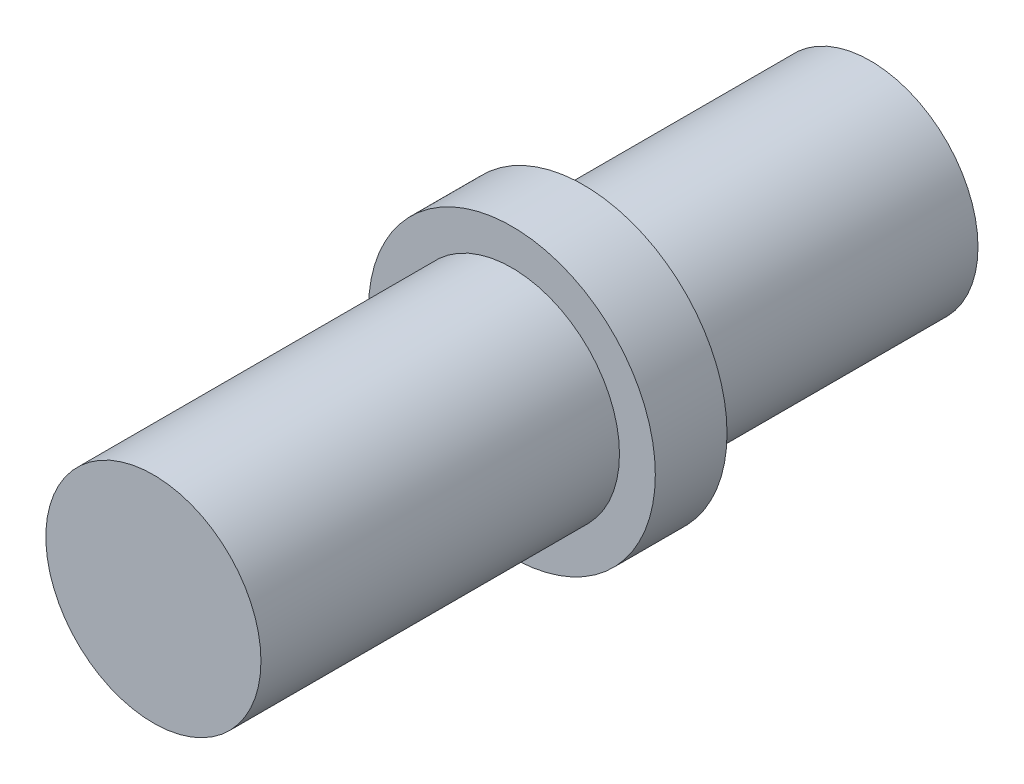
ISO-10303-21;
HEADER;
FILE_DESCRIPTION(('STEP AP214'),'2;1');
FILE_NAME('part.step','',(''),(''),'','','');
FILE_SCHEMA(('AUTOMOTIVE_DESIGN { 1 0 10303 214 1 1 1 1 }'));
ENDSEC;
DATA;
#1=APPLICATION_CONTEXT('core data for automotive mechanical design processes');
#2=APPLICATION_PROTOCOL_DEFINITION('international standard','automotive_design',2000,#1);
#3=PRODUCT_CONTEXT('',#1,'mechanical');
#4=PRODUCT('Part','Part','',(#3));
#5=PRODUCT_RELATED_PRODUCT_CATEGORY('part','',(#4));
#6=PRODUCT_DEFINITION_FORMATION('','',#4);
#7=PRODUCT_DEFINITION_CONTEXT('part definition',#1,'design');
#8=PRODUCT_DEFINITION('design','',#6,#7);
#9=PRODUCT_DEFINITION_SHAPE('','',#8);
#10=(LENGTH_UNIT() NAMED_UNIT(*) SI_UNIT(.MILLI.,.METRE.));
#11=(NAMED_UNIT(*) PLANE_ANGLE_UNIT() SI_UNIT($,.RADIAN.));
#12=(NAMED_UNIT(*) SI_UNIT($,.STERADIAN.) SOLID_ANGLE_UNIT());
#13=UNCERTAINTY_MEASURE_WITH_UNIT(LENGTH_MEASURE(1.E-05),#10,'distance_accuracy_value','');
#14=(GEOMETRIC_REPRESENTATION_CONTEXT(3) GLOBAL_UNCERTAINTY_ASSIGNED_CONTEXT((#13)) GLOBAL_UNIT_ASSIGNED_CONTEXT((#10,
#11,#12)) REPRESENTATION_CONTEXT('',''));
#15=CARTESIAN_POINT('',(0.,0.,0.));
#16=DIRECTION('',(0.,0.,1.));
#17=DIRECTION('',(1.,0.,0.));
#18=AXIS2_PLACEMENT_3D('',#15,#16,#17);
#19=CARTESIAN_POINT('',(0.,0.,20.));
#20=DIRECTION('',(0.,0.,-1.));
#21=DIRECTION('',(-1.,0.,0.));
#22=AXIS2_PLACEMENT_3D('',#19,#20,#21);
#23=CYLINDRICAL_SURFACE('',#22,3.);
#24=CARTESIAN_POINT('',(0.,0.,10.));
#25=DIRECTION('',(0.,0.,1.));
#26=DIRECTION('',(1.,0.,0.));
#27=AXIS2_PLACEMENT_3D('',#24,#25,#26);
#28=CIRCLE('',#27,3.);
#29=CARTESIAN_POINT('',(3.,0.,10.));
#30=VERTEX_POINT('',#29);
#31=EDGE_CURVE('E40',#30,#30,#28,.T.);
#32=ORIENTED_EDGE('',*,*,#31,.T.);
#33=EDGE_LOOP('',(#32));
#34=FACE_BOUND('',#33,.T.);
#35=CARTESIAN_POINT('',(0.,0.,20.));
#36=DIRECTION('',(0.,0.,1.));
#37=DIRECTION('',(1.,0.,0.));
#38=AXIS2_PLACEMENT_3D('',#35,#36,#37);
#39=CIRCLE('',#38,3.);
#40=CARTESIAN_POINT('',(3.,0.,20.));
#41=VERTEX_POINT('',#40);
#42=EDGE_CURVE('E44',#41,#41,#39,.T.);
#43=ORIENTED_EDGE('',*,*,#42,.F.);
#44=EDGE_LOOP('',(#43));
#45=FACE_BOUND('',#44,.T.);
#46=ADVANCED_FACE('F37',(#34,#45),#23,.T.);
#47=CARTESIAN_POINT('',(0.,0.,20.));
#48=DIRECTION('',(0.,0.,1.));
#49=DIRECTION('',(1.,0.,0.));
#50=AXIS2_PLACEMENT_3D('',#47,#48,#49);
#51=PLANE('',#50);
#52=ORIENTED_EDGE('',*,*,#42,.T.);
#53=EDGE_LOOP('',(#52));
#54=FACE_BOUND('',#53,.T.);
#55=ADVANCED_FACE('F76',(#54),#51,.T.);
#56=CARTESIAN_POINT('',(0.,0.,10.));
#57=DIRECTION('',(0.,0.,-1.));
#58=DIRECTION('',(-1.,0.,0.));
#59=AXIS2_PLACEMENT_3D('',#56,#57,#58);
#60=CYLINDRICAL_SURFACE('',#59,4.);
#61=CARTESIAN_POINT('',(0.,0.,10.));
#62=DIRECTION('',(0.,0.,1.));
#63=DIRECTION('',(1.,0.,0.));
#64=AXIS2_PLACEMENT_3D('',#61,#62,#63);
#65=CIRCLE('',#64,4.);
#66=CARTESIAN_POINT('',(4.,0.,10.));
#67=VERTEX_POINT('',#66);
#68=EDGE_CURVE('E56',#67,#67,#65,.T.);
#69=ORIENTED_EDGE('',*,*,#68,.F.);
#70=EDGE_LOOP('',(#69));
#71=FACE_BOUND('',#70,.T.);
#72=CARTESIAN_POINT('',(0.,0.,8.));
#73=DIRECTION('',(0.,0.,1.));
#74=DIRECTION('',(1.,0.,0.));
#75=AXIS2_PLACEMENT_3D('',#72,#73,#74);
#76=CIRCLE('',#75,4.);
#77=CARTESIAN_POINT('',(4.,0.,8.));
#78=VERTEX_POINT('',#77);
#79=EDGE_CURVE('E53',#78,#78,#76,.T.);
#80=ORIENTED_EDGE('',*,*,#79,.T.);
#81=EDGE_LOOP('',(#80));
#82=FACE_BOUND('',#81,.T.);
#83=ADVANCED_FACE('F68',(#71,#82),#60,.T.);
#84=CARTESIAN_POINT('',(0.,0.,10.));
#85=DIRECTION('',(0.,0.,1.));
#86=DIRECTION('',(1.,0.,0.));
#87=AXIS2_PLACEMENT_3D('',#84,#85,#86);
#88=PLANE('',#87);
#89=ORIENTED_EDGE('',*,*,#31,.F.);
#90=EDGE_LOOP('',(#89));
#91=FACE_BOUND('',#90,.T.);
#92=ORIENTED_EDGE('',*,*,#68,.T.);
#93=EDGE_LOOP('',(#92));
#94=FACE_BOUND('',#93,.T.);
#95=ADVANCED_FACE('F65',(#91,#94),#88,.T.);
#96=CARTESIAN_POINT('',(0.,0.,8.));
#97=DIRECTION('',(0.,0.,1.));
#98=DIRECTION('',(1.,0.,0.));
#99=AXIS2_PLACEMENT_3D('',#96,#97,#98);
#100=PLANE('',#99);
#101=CARTESIAN_POINT('',(0.,0.,8.));
#102=DIRECTION('',(0.,0.,1.));
#103=DIRECTION('',(1.,0.,0.));
#104=AXIS2_PLACEMENT_3D('',#101,#102,#103);
#105=CIRCLE('',#104,3.);
#106=CARTESIAN_POINT('',(3.,0.,8.));
#107=VERTEX_POINT('',#106);
#108=EDGE_CURVE('E10',#107,#107,#105,.T.);
#109=ORIENTED_EDGE('',*,*,#108,.T.);
#110=EDGE_LOOP('',(#109));
#111=FACE_BOUND('',#110,.T.);
#112=ORIENTED_EDGE('',*,*,#79,.F.);
#113=EDGE_LOOP('',(#112));
#114=FACE_BOUND('',#113,.T.);
#115=ADVANCED_FACE('F67',(#111,#114),#100,.F.);
#116=CARTESIAN_POINT('',(0.,0.,0.));
#117=DIRECTION('',(0.,0.,1.));
#118=DIRECTION('',(1.,0.,0.));
#119=AXIS2_PLACEMENT_3D('',#116,#117,#118);
#120=PLANE('',#119);
#121=CARTESIAN_POINT('',(0.,0.,0.));
#122=DIRECTION('',(0.,0.,1.));
#123=DIRECTION('',(1.,0.,0.));
#124=AXIS2_PLACEMENT_3D('',#121,#122,#123);
#125=CIRCLE('',#124,3.);
#126=CARTESIAN_POINT('',(3.,0.,0.));
#127=VERTEX_POINT('',#126);
#128=EDGE_CURVE('E48',#127,#127,#125,.T.);
#129=ORIENTED_EDGE('',*,*,#128,.F.);
#130=EDGE_LOOP('',(#129));
#131=FACE_BOUND('',#130,.T.);
#132=ADVANCED_FACE('F74',(#131),#120,.F.);
#133=ORIENTED_EDGE('',*,*,#128,.T.);
#134=EDGE_LOOP('',(#133));
#135=FACE_BOUND('',#134,.T.);
#136=ORIENTED_EDGE('',*,*,#108,.F.);
#137=EDGE_LOOP('',(#136));
#138=FACE_BOUND('',#137,.T.);
#139=ADVANCED_FACE('F80',(#135,#138),#23,.T.);
#140=CLOSED_SHELL('',(#46,#55,#83,#95,#115,#132,#139));
#141=MANIFOLD_SOLID_BREP('B2',#140);
#142=ADVANCED_BREP_SHAPE_REPRESENTATION('',(#18,#141),#14);
#143=SHAPE_DEFINITION_REPRESENTATION(#9,#142);
ENDSEC;
END-ISO-10303-21;
